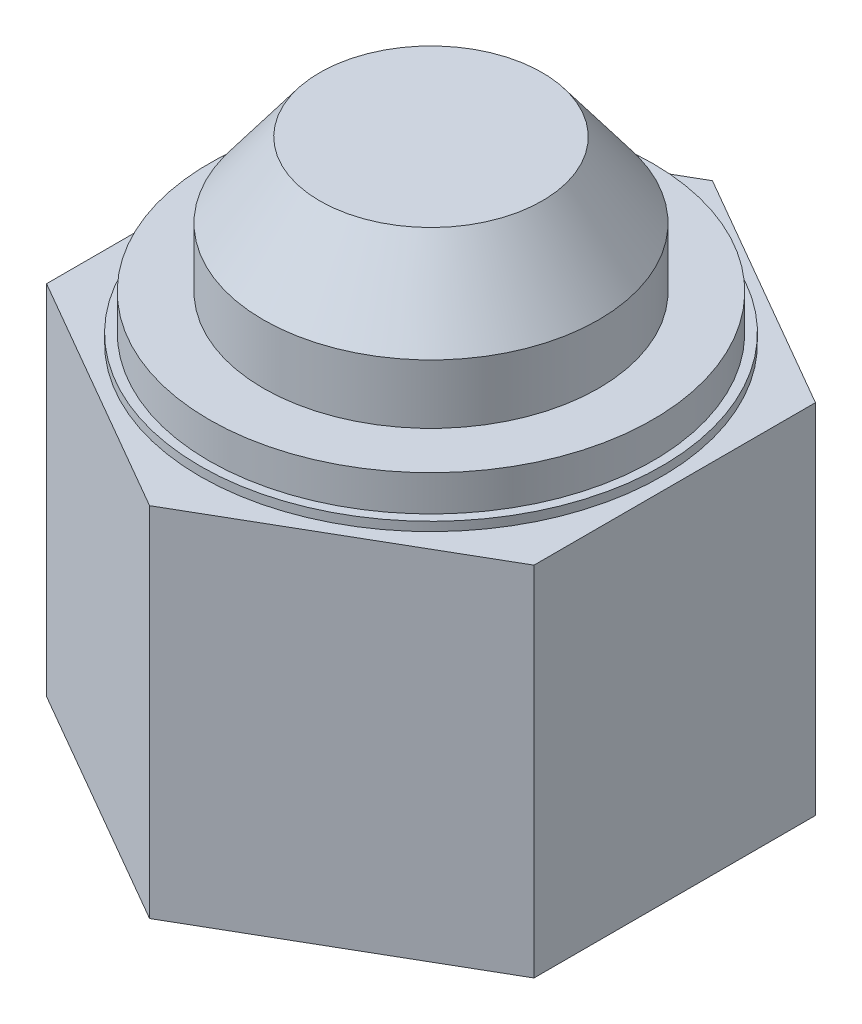
ISO-10303-21;
HEADER;
FILE_DESCRIPTION(('STEP AP214'),'2;1');
FILE_NAME('part.step','',(''),(''),'','','');
FILE_SCHEMA(('AUTOMOTIVE_DESIGN { 1 0 10303 214 1 1 1 1 }'));
ENDSEC;
DATA;
#1=APPLICATION_CONTEXT('core data for automotive mechanical design processes');
#2=APPLICATION_PROTOCOL_DEFINITION('international standard','automotive_design',2000,#1);
#3=PRODUCT_CONTEXT('',#1,'mechanical');
#4=PRODUCT('Part','Part','',(#3));
#5=PRODUCT_RELATED_PRODUCT_CATEGORY('part','',(#4));
#6=PRODUCT_DEFINITION_FORMATION('','',#4);
#7=PRODUCT_DEFINITION_CONTEXT('part definition',#1,'design');
#8=PRODUCT_DEFINITION('design','',#6,#7);
#9=PRODUCT_DEFINITION_SHAPE('','',#8);
#10=(LENGTH_UNIT() NAMED_UNIT(*) SI_UNIT(.MILLI.,.METRE.));
#11=(NAMED_UNIT(*) PLANE_ANGLE_UNIT() SI_UNIT($,.RADIAN.));
#12=(NAMED_UNIT(*) SI_UNIT($,.STERADIAN.) SOLID_ANGLE_UNIT());
#13=UNCERTAINTY_MEASURE_WITH_UNIT(LENGTH_MEASURE(1.E-05),#10,'distance_accuracy_value','');
#14=(GEOMETRIC_REPRESENTATION_CONTEXT(3) GLOBAL_UNCERTAINTY_ASSIGNED_CONTEXT((#13)) GLOBAL_UNIT_ASSIGNED_CONTEXT((#10,
#11,#12)) REPRESENTATION_CONTEXT('',''));
#15=CARTESIAN_POINT('',(0.,0.,0.));
#16=DIRECTION('',(0.,0.,1.));
#17=DIRECTION('',(1.,0.,0.));
#18=AXIS2_PLACEMENT_3D('',#15,#16,#17);
#19=CARTESIAN_POINT('',(0.,5.08,0.));
#20=DIRECTION('',(0.,-1.,0.));
#21=DIRECTION('',(0.,0.,-1.));
#22=AXIS2_PLACEMENT_3D('',#19,#20,#21);
#23=CYLINDRICAL_SURFACE('',#22,4.7625);
#24=CARTESIAN_POINT('',(0.,2.95399993399999,0.));
#25=DIRECTION('',(0.,1.,0.));
#26=DIRECTION('',(0.,0.,1.));
#27=AXIS2_PLACEMENT_3D('',#24,#25,#26);
#28=CIRCLE('',#27,4.7625);
#29=CARTESIAN_POINT('',(0.,2.95399993399999,4.7625));
#30=VERTEX_POINT('',#29);
#31=EDGE_CURVE('E60',#30,#30,#28,.F.);
#32=ORIENTED_EDGE('',*,*,#31,.T.);
#33=EDGE_LOOP('',(#32));
#34=FACE_BOUND('',#33,.T.);
#35=CARTESIAN_POINT('',(0.,1.27,0.));
#36=DIRECTION('',(0.,1.,0.));
#37=DIRECTION('',(0.,0.,1.));
#38=AXIS2_PLACEMENT_3D('',#35,#36,#37);
#39=CIRCLE('',#38,4.7625);
#40=CARTESIAN_POINT('',(0.,1.27,4.7625));
#41=VERTEX_POINT('',#40);
#42=EDGE_CURVE('E190',#41,#41,#39,.T.);
#43=ORIENTED_EDGE('',*,*,#42,.T.);
#44=EDGE_LOOP('',(#43));
#45=FACE_BOUND('',#44,.T.);
#46=ADVANCED_FACE('F49',(#34,#45),#23,.T.);
#47=CARTESIAN_POINT('',(0.,5.08,0.));
#48=DIRECTION('',(0.,1.,0.));
#49=DIRECTION('',(0.,0.,1.));
#50=AXIS2_PLACEMENT_3D('',#47,#48,#49);
#51=PLANE('',#50);
#52=CARTESIAN_POINT('',(0.,5.08,0.));
#53=DIRECTION('',(0.,1.,0.));
#54=DIRECTION('',(0.,0.,1.));
#55=AXIS2_PLACEMENT_3D('',#52,#53,#54);
#56=CIRCLE('',#55,3.16044403974689);
#57=CARTESIAN_POINT('',(0.,5.08,3.16044403974689));
#58=VERTEX_POINT('',#57);
#59=EDGE_CURVE('E194',#58,#58,#56,.T.);
#60=ORIENTED_EDGE('',*,*,#59,.T.);
#61=EDGE_LOOP('',(#60));
#62=FACE_BOUND('',#61,.T.);
#63=ADVANCED_FACE('F240',(#62),#51,.T.);
#64=CARTESIAN_POINT('',(0.,1.27,0.));
#65=DIRECTION('',(0.,-1.,0.));
#66=DIRECTION('',(0.,0.,-1.));
#67=AXIS2_PLACEMENT_3D('',#64,#65,#66);
#68=CYLINDRICAL_SURFACE('',#67,6.30422973921278);
#69=CARTESIAN_POINT('',(0.,0.254,0.));
#70=DIRECTION('',(0.,1.,0.));
#71=DIRECTION('',(0.,0.,1.));
#72=AXIS2_PLACEMENT_3D('',#69,#70,#71);
#73=CIRCLE('',#72,6.30422973921278);
#74=CARTESIAN_POINT('',(0.,0.254,6.30422973921278));
#75=VERTEX_POINT('',#74);
#76=EDGE_CURVE('E185',#75,#75,#73,.T.);
#77=ORIENTED_EDGE('',*,*,#76,.T.);
#78=EDGE_LOOP('',(#77));
#79=FACE_BOUND('',#78,.T.);
#80=CARTESIAN_POINT('',(0.,1.27,0.));
#81=DIRECTION('',(0.,1.,0.));
#82=DIRECTION('',(0.,0.,1.));
#83=AXIS2_PLACEMENT_3D('',#80,#81,#82);
#84=CIRCLE('',#83,6.30422973921278);
#85=CARTESIAN_POINT('',(0.,1.27,6.30422973921278));
#86=VERTEX_POINT('',#85);
#87=EDGE_CURVE('E186',#86,#86,#84,.T.);
#88=ORIENTED_EDGE('',*,*,#87,.F.);
#89=EDGE_LOOP('',(#88));
#90=FACE_BOUND('',#89,.T.);
#91=ADVANCED_FACE('F204',(#79,#90),#68,.T.);
#92=CARTESIAN_POINT('',(0.,1.27,0.));
#93=DIRECTION('',(0.,1.,0.));
#94=DIRECTION('',(0.,0.,1.));
#95=AXIS2_PLACEMENT_3D('',#92,#93,#94);
#96=PLANE('',#95);
#97=ORIENTED_EDGE('',*,*,#42,.F.);
#98=EDGE_LOOP('',(#97));
#99=FACE_BOUND('',#98,.T.);
#100=ORIENTED_EDGE('',*,*,#87,.T.);
#101=EDGE_LOOP('',(#100));
#102=FACE_BOUND('',#101,.T.);
#103=ADVANCED_FACE('F255',(#99,#102),#96,.T.);
#104=CARTESIAN_POINT('',(0.,5.08,0.));
#105=DIRECTION('',(0.,-1.,0.));
#106=DIRECTION('',(0.,0.,-1.));
#107=AXIS2_PLACEMENT_3D('',#104,#105,#106);
#108=CONICAL_SURFACE('',#107,3.16044403974689,0.6457718232379);
#109=ORIENTED_EDGE('',*,*,#31,.F.);
#110=EDGE_LOOP('',(#109));
#111=FACE_BOUND('',#110,.T.);
#112=ORIENTED_EDGE('',*,*,#59,.F.);
#113=EDGE_LOOP('',(#112));
#114=FACE_BOUND('',#113,.T.);
#115=ADVANCED_FACE('F52',(#111,#114),#108,.T.);
#116=CARTESIAN_POINT('',(0.,0.254,0.));
#117=DIRECTION('',(0.,-1.,0.));
#118=DIRECTION('',(0.,0.,-1.));
#119=AXIS2_PLACEMENT_3D('',#116,#117,#118);
#120=CYLINDRICAL_SURFACE('',#119,6.55951029518552);
#121=CARTESIAN_POINT('',(0.,0.254,0.));
#122=DIRECTION('',(0.,1.,0.));
#123=DIRECTION('',(0.,0.,1.));
#124=AXIS2_PLACEMENT_3D('',#121,#122,#123);
#125=CIRCLE('',#124,6.55951029518552);
#126=CARTESIAN_POINT('',(0.,0.254,6.55951029518552));
#127=VERTEX_POINT('',#126);
#128=EDGE_CURVE('E181',#127,#127,#125,.T.);
#129=ORIENTED_EDGE('',*,*,#128,.F.);
#130=EDGE_LOOP('',(#129));
#131=FACE_BOUND('',#130,.T.);
#132=CARTESIAN_POINT('',(0.,0.,0.));
#133=DIRECTION('',(0.,1.,0.));
#134=DIRECTION('',(0.,0.,1.));
#135=AXIS2_PLACEMENT_3D('',#132,#133,#134);
#136=CIRCLE('',#135,6.55951029518552);
#137=CARTESIAN_POINT('',(0.,0.,6.55951029518552));
#138=VERTEX_POINT('',#137);
#139=EDGE_CURVE('E168',#138,#138,#136,.T.);
#140=ORIENTED_EDGE('',*,*,#139,.T.);
#141=EDGE_LOOP('',(#140));
#142=FACE_BOUND('',#141,.T.);
#143=ADVANCED_FACE('F211',(#131,#142),#120,.T.);
#144=CARTESIAN_POINT('',(0.,0.254,0.));
#145=DIRECTION('',(0.,1.,0.));
#146=DIRECTION('',(0.,0.,1.));
#147=AXIS2_PLACEMENT_3D('',#144,#145,#146);
#148=PLANE('',#147);
#149=ORIENTED_EDGE('',*,*,#76,.F.);
#150=EDGE_LOOP('',(#149));
#151=FACE_BOUND('',#150,.T.);
#152=ORIENTED_EDGE('',*,*,#128,.T.);
#153=EDGE_LOOP('',(#152));
#154=FACE_BOUND('',#153,.T.);
#155=ADVANCED_FACE('F207',(#151,#154),#148,.T.);
#156=CARTESIAN_POINT('',(6.92548806124741,-10.16,0.));
#157=DIRECTION('',(1.,0.,0.));
#158=DIRECTION('',(0.,0.,-1.));
#159=AXIS2_PLACEMENT_3D('',#156,#157,#158);
#160=PLANE('',#159);
#161=DIRECTION('',(0.,0.,-1.));
#162=VECTOR('',#161,1.);
#163=CARTESIAN_POINT('',(6.92548806124741,0.,0.));
#164=LINE('',#163,#162);
#165=CARTESIAN_POINT('',(6.92548806124746,0.,3.99843239643067));
#166=VERTEX_POINT('',#165);
#167=CARTESIAN_POINT('',(6.92548806124737,0.,-3.99843239643082));
#168=VERTEX_POINT('',#167);
#169=EDGE_CURVE('E144',#166,#168,#164,.T.);
#170=ORIENTED_EDGE('',*,*,#169,.F.);
#171=DIRECTION('',(0.,1.,0.));
#172=VECTOR('',#171,1.);
#173=CARTESIAN_POINT('',(6.92548806124746,-10.16,3.99843239643067));
#174=LINE('',#173,#172);
#175=CARTESIAN_POINT('',(6.92548806124746,-10.16,3.99843239643067));
#176=VERTEX_POINT('',#175);
#177=EDGE_CURVE('E68',#176,#166,#174,.T.);
#178=ORIENTED_EDGE('',*,*,#177,.F.);
#179=DIRECTION('',(0.,0.,-1.));
#180=VECTOR('',#179,1.);
#181=CARTESIAN_POINT('',(6.92548806124741,-10.16,0.));
#182=LINE('',#181,#180);
#183=CARTESIAN_POINT('',(6.92548806124737,-10.16,-3.99843239643082));
#184=VERTEX_POINT('',#183);
#185=EDGE_CURVE('E225',#176,#184,#182,.T.);
#186=ORIENTED_EDGE('',*,*,#185,.T.);
#187=DIRECTION('',(0.,1.,0.));
#188=VECTOR('',#187,1.);
#189=CARTESIAN_POINT('',(6.92548806124737,-10.16,-3.99843239643082));
#190=LINE('',#189,#188);
#191=EDGE_CURVE('E103',#184,#168,#190,.T.);
#192=ORIENTED_EDGE('',*,*,#191,.T.);
#193=EDGE_LOOP('',(#170,#178,#186,#192));
#194=FACE_BOUND('',#193,.T.);
#195=ADVANCED_FACE('F210',(#194),#160,.T.);
#196=CARTESIAN_POINT('',(3.46274403062375,-10.16,5.99764859464607));
#197=DIRECTION('',(0.500000000000007,0.,0.866025403784434));
#198=DIRECTION('',(0.866025403784435,0.,-0.500000000000007));
#199=AXIS2_PLACEMENT_3D('',#196,#197,#198);
#200=PLANE('',#199);
#201=DIRECTION('',(0.866025403784435,0.,-0.500000000000007));
#202=VECTOR('',#201,1.);
#203=CARTESIAN_POINT('',(3.46274403062375,0.,5.99764859464607));
#204=LINE('',#203,#202);
#205=CARTESIAN_POINT('',(0.,0.,7.99686479286147));
#206=VERTEX_POINT('',#205);
#207=EDGE_CURVE('E161',#206,#166,#204,.T.);
#208=ORIENTED_EDGE('',*,*,#207,.F.);
#209=DIRECTION('',(0.,1.,0.));
#210=VECTOR('',#209,1.);
#211=CARTESIAN_POINT('',(0.,-10.16,7.99686479286147));
#212=LINE('',#211,#210);
#213=CARTESIAN_POINT('',(0.,-10.16,7.99686479286147));
#214=VERTEX_POINT('',#213);
#215=EDGE_CURVE('E91',#214,#206,#212,.T.);
#216=ORIENTED_EDGE('',*,*,#215,.F.);
#217=DIRECTION('',(0.866025403784435,0.,-0.500000000000007));
#218=VECTOR('',#217,1.);
#219=CARTESIAN_POINT('',(3.46274403062375,-10.16,5.99764859464607));
#220=LINE('',#219,#218);
#221=EDGE_CURVE('E130',#214,#176,#220,.T.);
#222=ORIENTED_EDGE('',*,*,#221,.T.);
#223=ORIENTED_EDGE('',*,*,#177,.T.);
#224=EDGE_LOOP('',(#208,#216,#222,#223));
#225=FACE_BOUND('',#224,.T.);
#226=ADVANCED_FACE('F230',(#225),#200,.T.);
#227=CARTESIAN_POINT('',(-3.46274403062367,-10.16,5.99764859464612));
#228=DIRECTION('',(-0.499999999999995,0.,0.866025403784441));
#229=DIRECTION('',(0.866025403784442,0.,0.499999999999995));
#230=AXIS2_PLACEMENT_3D('',#227,#228,#229);
#231=PLANE('',#230);
#232=DIRECTION('',(0.866025403784442,0.,0.499999999999995));
#233=VECTOR('',#232,1.);
#234=CARTESIAN_POINT('',(-3.46274403062367,0.,5.99764859464612));
#235=LINE('',#234,#233);
#236=CARTESIAN_POINT('',(-6.9254880612474,0.,3.99843239643077));
#237=VERTEX_POINT('',#236);
#238=EDGE_CURVE('E116',#237,#206,#235,.T.);
#239=ORIENTED_EDGE('',*,*,#238,.F.);
#240=DIRECTION('',(0.,1.,0.));
#241=VECTOR('',#240,1.);
#242=CARTESIAN_POINT('',(-6.9254880612474,-10.16,3.99843239643077));
#243=LINE('',#242,#241);
#244=CARTESIAN_POINT('',(-6.9254880612474,-10.16,3.99843239643077));
#245=VERTEX_POINT('',#244);
#246=EDGE_CURVE('E111',#245,#237,#243,.T.);
#247=ORIENTED_EDGE('',*,*,#246,.F.);
#248=DIRECTION('',(0.866025403784442,0.,0.499999999999995));
#249=VECTOR('',#248,1.);
#250=CARTESIAN_POINT('',(-3.46274403062367,-10.16,5.99764859464612));
#251=LINE('',#250,#249);
#252=EDGE_CURVE('E114',#245,#214,#251,.T.);
#253=ORIENTED_EDGE('',*,*,#252,.T.);
#254=ORIENTED_EDGE('',*,*,#215,.T.);
#255=EDGE_LOOP('',(#239,#247,#253,#254));
#256=FACE_BOUND('',#255,.T.);
#257=ADVANCED_FACE('F113',(#256),#231,.T.);
#258=CARTESIAN_POINT('',(-6.92548806124741,-10.16,0.));
#259=DIRECTION('',(-1.,0.,0.));
#260=DIRECTION('',(0.,0.,1.));
#261=AXIS2_PLACEMENT_3D('',#258,#259,#260);
#262=PLANE('',#261);
#263=DIRECTION('',(0.,0.,1.));
#264=VECTOR('',#263,1.);
#265=CARTESIAN_POINT('',(-6.92548806124741,0.,0.));
#266=LINE('',#265,#264);
#267=CARTESIAN_POINT('',(-6.92548806124743,0.,-3.99843239643072));
#268=VERTEX_POINT('',#267);
#269=EDGE_CURVE('E156',#268,#237,#266,.T.);
#270=ORIENTED_EDGE('',*,*,#269,.F.);
#271=DIRECTION('',(0.,1.,0.));
#272=VECTOR('',#271,1.);
#273=CARTESIAN_POINT('',(-6.92548806124743,-10.16,-3.99843239643072));
#274=LINE('',#273,#272);
#275=CARTESIAN_POINT('',(-6.92548806124743,-10.16,-3.99843239643072));
#276=VERTEX_POINT('',#275);
#277=EDGE_CURVE('E122',#276,#268,#274,.T.);
#278=ORIENTED_EDGE('',*,*,#277,.F.);
#279=DIRECTION('',(0.,0.,1.));
#280=VECTOR('',#279,1.);
#281=CARTESIAN_POINT('',(-6.92548806124741,-10.16,0.));
#282=LINE('',#281,#280);
#283=EDGE_CURVE('E128',#276,#245,#282,.T.);
#284=ORIENTED_EDGE('',*,*,#283,.T.);
#285=ORIENTED_EDGE('',*,*,#246,.T.);
#286=EDGE_LOOP('',(#270,#278,#284,#285));
#287=FACE_BOUND('',#286,.T.);
#288=ADVANCED_FACE('F133',(#287),#262,.T.);
#289=CARTESIAN_POINT('',(-3.46274403062371,-10.16,-5.9976485946461));
#290=DIRECTION('',(-0.500000000000001,0.,-0.866025403784438));
#291=DIRECTION('',(-0.866025403784438,0.,0.500000000000001));
#292=AXIS2_PLACEMENT_3D('',#289,#290,#291);
#293=PLANE('',#292);
#294=DIRECTION('',(-0.866025403784438,0.,0.500000000000001));
#295=VECTOR('',#294,1.);
#296=CARTESIAN_POINT('',(-3.46274403062371,0.,-5.9976485946461));
#297=LINE('',#296,#295);
#298=CARTESIAN_POINT('',(0.,0.,-7.99686479286147));
#299=VERTEX_POINT('',#298);
#300=EDGE_CURVE('E152',#299,#268,#297,.T.);
#301=ORIENTED_EDGE('',*,*,#300,.F.);
#302=DIRECTION('',(0.,1.,0.));
#303=VECTOR('',#302,1.);
#304=CARTESIAN_POINT('',(0.,-10.16,-7.99686479286147));
#305=LINE('',#304,#303);
#306=CARTESIAN_POINT('',(0.,-10.16,-7.99686479286147));
#307=VERTEX_POINT('',#306);
#308=EDGE_CURVE('E173',#307,#299,#305,.T.);
#309=ORIENTED_EDGE('',*,*,#308,.F.);
#310=DIRECTION('',(-0.866025403784438,0.,0.500000000000001));
#311=VECTOR('',#310,1.);
#312=CARTESIAN_POINT('',(-3.46274403062371,-10.16,-5.9976485946461));
#313=LINE('',#312,#311);
#314=EDGE_CURVE('E135',#307,#276,#313,.T.);
#315=ORIENTED_EDGE('',*,*,#314,.T.);
#316=ORIENTED_EDGE('',*,*,#277,.T.);
#317=EDGE_LOOP('',(#301,#309,#315,#316));
#318=FACE_BOUND('',#317,.T.);
#319=ADVANCED_FACE('F229',(#318),#293,.T.);
#320=CARTESIAN_POINT('',(0.,-10.16,0.));
#321=DIRECTION('',(0.,1.,0.));
#322=DIRECTION('',(0.,0.,1.));
#323=AXIS2_PLACEMENT_3D('',#320,#321,#322);
#324=CYLINDRICAL_SURFACE('',#323,6.35);
#325=CARTESIAN_POINT('',(0.,-10.16,0.));
#326=DIRECTION('',(0.,1.,0.));
#327=DIRECTION('',(0.,0.,1.));
#328=AXIS2_PLACEMENT_3D('',#325,#326,#327);
#329=CIRCLE('',#328,6.35);
#330=CARTESIAN_POINT('',(0.,-10.16,6.35));
#331=VERTEX_POINT('',#330);
#332=EDGE_CURVE('E165',#331,#331,#329,.T.);
#333=ORIENTED_EDGE('',*,*,#332,.F.);
#334=EDGE_LOOP('',(#333));
#335=FACE_BOUND('',#334,.T.);
#336=CARTESIAN_POINT('',(0.,0.,0.));
#337=DIRECTION('',(0.,1.,0.));
#338=DIRECTION('',(0.,0.,1.));
#339=AXIS2_PLACEMENT_3D('',#336,#337,#338);
#340=CIRCLE('',#339,6.35);
#341=CARTESIAN_POINT('',(0.,0.,6.35));
#342=VERTEX_POINT('',#341);
#343=EDGE_CURVE('E11',#342,#342,#340,.T.);
#344=ORIENTED_EDGE('',*,*,#343,.T.);
#345=EDGE_LOOP('',(#344));
#346=FACE_BOUND('',#345,.T.);
#347=ADVANCED_FACE('F258',(#335,#346),#324,.F.);
#348=CARTESIAN_POINT('',(3.46274403062369,-10.16,-5.99764859464614));
#349=DIRECTION('',(0.499999999999995,0.,-0.866025403784441));
#350=DIRECTION('',(-0.866025403784442,0.,-0.499999999999995));
#351=AXIS2_PLACEMENT_3D('',#348,#349,#350);
#352=PLANE('',#351);
#353=DIRECTION('',(-0.866025403784441,0.,-0.499999999999995));
#354=VECTOR('',#353,1.);
#355=CARTESIAN_POINT('',(3.46274403062369,0.,-5.99764859464614));
#356=LINE('',#355,#354);
#357=EDGE_CURVE('E148',#168,#299,#356,.T.);
#358=ORIENTED_EDGE('',*,*,#357,.F.);
#359=ORIENTED_EDGE('',*,*,#191,.F.);
#360=DIRECTION('',(-0.866025403784441,0.,-0.499999999999995));
#361=VECTOR('',#360,1.);
#362=CARTESIAN_POINT('',(3.46274403062369,-10.16,-5.99764859464614));
#363=LINE('',#362,#361);
#364=EDGE_CURVE('E138',#184,#307,#363,.T.);
#365=ORIENTED_EDGE('',*,*,#364,.T.);
#366=ORIENTED_EDGE('',*,*,#308,.T.);
#367=EDGE_LOOP('',(#358,#359,#365,#366));
#368=FACE_BOUND('',#367,.T.);
#369=ADVANCED_FACE('F226',(#368),#352,.T.);
#370=CARTESIAN_POINT('',(0.,-10.16,0.));
#371=DIRECTION('',(0.,1.,0.));
#372=DIRECTION('',(0.,0.,1.));
#373=AXIS2_PLACEMENT_3D('',#370,#371,#372);
#374=PLANE('',#373);
#375=ORIENTED_EDGE('',*,*,#332,.T.);
#376=EDGE_LOOP('',(#375));
#377=FACE_BOUND('',#376,.T.);
#378=ORIENTED_EDGE('',*,*,#185,.F.);
#379=ORIENTED_EDGE('',*,*,#221,.F.);
#380=ORIENTED_EDGE('',*,*,#252,.F.);
#381=ORIENTED_EDGE('',*,*,#283,.F.);
#382=ORIENTED_EDGE('',*,*,#314,.F.);
#383=ORIENTED_EDGE('',*,*,#364,.F.);
#384=EDGE_LOOP('',(#378,#379,#380,#381,#382,#383));
#385=FACE_BOUND('',#384,.T.);
#386=ADVANCED_FACE('F126',(#377,#385),#374,.F.);
#387=CARTESIAN_POINT('',(0.,0.,0.));
#388=DIRECTION('',(0.,1.,0.));
#389=DIRECTION('',(0.,0.,1.));
#390=AXIS2_PLACEMENT_3D('',#387,#388,#389);
#391=PLANE('',#390);
#392=ORIENTED_EDGE('',*,*,#139,.F.);
#393=EDGE_LOOP('',(#392));
#394=FACE_BOUND('',#393,.T.);
#395=ORIENTED_EDGE('',*,*,#169,.T.);
#396=ORIENTED_EDGE('',*,*,#357,.T.);
#397=ORIENTED_EDGE('',*,*,#300,.T.);
#398=ORIENTED_EDGE('',*,*,#269,.T.);
#399=ORIENTED_EDGE('',*,*,#238,.T.);
#400=ORIENTED_EDGE('',*,*,#207,.T.);
#401=EDGE_LOOP('',(#395,#396,#397,#398,#399,#400));
#402=FACE_BOUND('',#401,.T.);
#403=ADVANCED_FACE('F220',(#394,#402),#391,.T.);
#404=CARTESIAN_POINT('',(0.,0.,0.));
#405=DIRECTION('',(0.,1.,0.));
#406=DIRECTION('',(0.,0.,1.));
#407=AXIS2_PLACEMENT_3D('',#404,#405,#406);
#408=PLANE('',#407);
#409=ORIENTED_EDGE('',*,*,#343,.F.);
#410=EDGE_LOOP('',(#409));
#411=FACE_BOUND('',#410,.T.);
#412=ADVANCED_FACE('F223',(#411),#408,.F.);
#413=CLOSED_SHELL('',(#46,#63,#91,#103,#115,#143,#155,#195,#226,#257,#288,#319,#347,#369,#386,
#403,#412));
#414=MANIFOLD_SOLID_BREP('B2',#413);
#415=ADVANCED_BREP_SHAPE_REPRESENTATION('',(#18,#414),#14);
#416=SHAPE_DEFINITION_REPRESENTATION(#9,#415);
ENDSEC;
END-ISO-10303-21;
